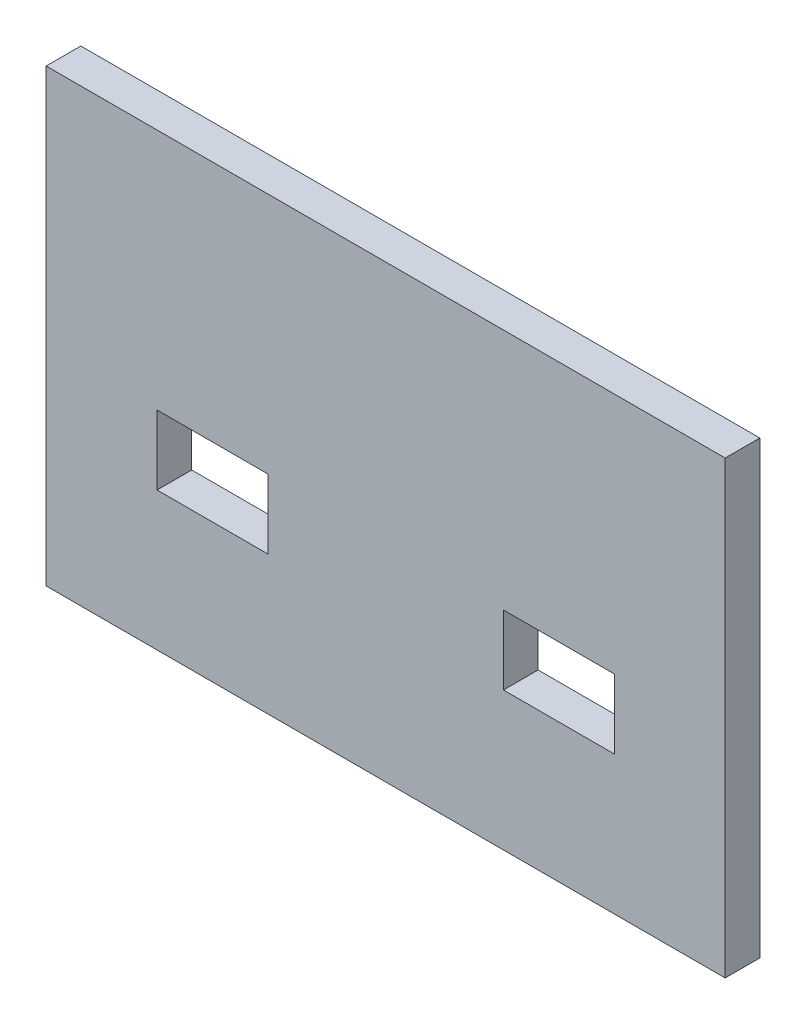
ISO-10303-21;
HEADER;
FILE_DESCRIPTION(('STEP AP214'),'2;1');
FILE_NAME('part.step','',(''),(''),'','','');
FILE_SCHEMA(('AUTOMOTIVE_DESIGN { 1 0 10303 214 1 1 1 1 }'));
ENDSEC;
DATA;
#1=APPLICATION_CONTEXT('core data for automotive mechanical design processes');
#2=APPLICATION_PROTOCOL_DEFINITION('international standard','automotive_design',2000,#1);
#3=PRODUCT_CONTEXT('',#1,'mechanical');
#4=PRODUCT('Part','Part','',(#3));
#5=PRODUCT_RELATED_PRODUCT_CATEGORY('part','',(#4));
#6=PRODUCT_DEFINITION_FORMATION('','',#4);
#7=PRODUCT_DEFINITION_CONTEXT('part definition',#1,'design');
#8=PRODUCT_DEFINITION('design','',#6,#7);
#9=PRODUCT_DEFINITION_SHAPE('','',#8);
#10=(LENGTH_UNIT() NAMED_UNIT(*) SI_UNIT(.MILLI.,.METRE.));
#11=(NAMED_UNIT(*) PLANE_ANGLE_UNIT() SI_UNIT($,.RADIAN.));
#12=(NAMED_UNIT(*) SI_UNIT($,.STERADIAN.) SOLID_ANGLE_UNIT());
#13=UNCERTAINTY_MEASURE_WITH_UNIT(LENGTH_MEASURE(1.E-05),#10,'distance_accuracy_value','');
#14=(GEOMETRIC_REPRESENTATION_CONTEXT(3) GLOBAL_UNCERTAINTY_ASSIGNED_CONTEXT((#13)) GLOBAL_UNIT_ASSIGNED_CONTEXT((#10,
#11,#12)) REPRESENTATION_CONTEXT('',''));
#15=CARTESIAN_POINT('',(0.,0.,0.));
#16=DIRECTION('',(0.,0.,1.));
#17=DIRECTION('',(1.,0.,0.));
#18=AXIS2_PLACEMENT_3D('',#15,#16,#17);
#19=CARTESIAN_POINT('',(0.,0.,5.));
#20=DIRECTION('',(0.,0.,1.));
#21=DIRECTION('',(1.,0.,0.));
#22=AXIS2_PLACEMENT_3D('',#19,#20,#21);
#23=PLANE('',#22);
#24=DIRECTION('',(0.,-1.,0.));
#25=VECTOR('',#24,1.);
#26=CARTESIAN_POINT('',(0.,0.,5.));
#27=LINE('',#26,#25);
#28=CARTESIAN_POINT('',(0.,0.,5.));
#29=VERTEX_POINT('',#28);
#30=CARTESIAN_POINT('',(0.,-65.,5.));
#31=VERTEX_POINT('',#30);
#32=EDGE_CURVE('E169',#29,#31,#27,.T.);
#33=ORIENTED_EDGE('',*,*,#32,.T.);
#34=DIRECTION('',(1.,0.,0.));
#35=VECTOR('',#34,1.);
#36=CARTESIAN_POINT('',(0.,-65.,5.));
#37=LINE('',#36,#35);
#38=CARTESIAN_POINT('',(98.,-65.,5.));
#39=VERTEX_POINT('',#38);
#40=EDGE_CURVE('E172',#31,#39,#37,.T.);
#41=ORIENTED_EDGE('',*,*,#40,.T.);
#42=DIRECTION('',(0.,1.,0.));
#43=VECTOR('',#42,1.);
#44=CARTESIAN_POINT('',(98.,0.,5.));
#45=LINE('',#44,#43);
#46=CARTESIAN_POINT('',(98.,0.,5.));
#47=VERTEX_POINT('',#46);
#48=EDGE_CURVE('E175',#39,#47,#45,.T.);
#49=ORIENTED_EDGE('',*,*,#48,.T.);
#50=DIRECTION('',(-1.,0.,0.));
#51=VECTOR('',#50,1.);
#52=CARTESIAN_POINT('',(0.,0.,5.));
#53=LINE('',#52,#51);
#54=EDGE_CURVE('E177',#47,#29,#53,.T.);
#55=ORIENTED_EDGE('',*,*,#54,.T.);
#56=EDGE_LOOP('',(#33,#41,#49,#55));
#57=FACE_BOUND('',#56,.T.);
#58=DIRECTION('',(1.,0.,0.));
#59=VECTOR('',#58,1.);
#60=CARTESIAN_POINT('',(0.,-35.,5.));
#61=LINE('',#60,#59);
#62=CARTESIAN_POINT('',(16.,-35.,5.));
#63=VERTEX_POINT('',#62);
#64=CARTESIAN_POINT('',(32.,-35.,5.));
#65=VERTEX_POINT('',#64);
#66=EDGE_CURVE('E150',#63,#65,#61,.T.);
#67=ORIENTED_EDGE('',*,*,#66,.T.);
#68=DIRECTION('',(0.,-1.,0.));
#69=VECTOR('',#68,1.);
#70=CARTESIAN_POINT('',(32.,0.,5.));
#71=LINE('',#70,#69);
#72=CARTESIAN_POINT('',(32.,-45.,5.));
#73=VERTEX_POINT('',#72);
#74=EDGE_CURVE('E145',#65,#73,#71,.T.);
#75=ORIENTED_EDGE('',*,*,#74,.T.);
#76=DIRECTION('',(1.,0.,0.));
#77=VECTOR('',#76,1.);
#78=CARTESIAN_POINT('',(0.,-45.,5.));
#79=LINE('',#78,#77);
#80=CARTESIAN_POINT('',(16.,-45.,5.));
#81=VERTEX_POINT('',#80);
#82=EDGE_CURVE('E156',#81,#73,#79,.T.);
#83=ORIENTED_EDGE('',*,*,#82,.F.);
#84=DIRECTION('',(0.,-1.,0.));
#85=VECTOR('',#84,1.);
#86=CARTESIAN_POINT('',(16.,0.,5.));
#87=LINE('',#86,#85);
#88=EDGE_CURVE('E153',#63,#81,#87,.T.);
#89=ORIENTED_EDGE('',*,*,#88,.F.);
#90=EDGE_LOOP('',(#67,#75,#83,#89));
#91=FACE_BOUND('',#90,.T.);
#92=DIRECTION('',(1.,0.,0.));
#93=VECTOR('',#92,1.);
#94=CARTESIAN_POINT('',(0.,-35.,5.));
#95=LINE('',#94,#93);
#96=CARTESIAN_POINT('',(66.,-35.,5.));
#97=VERTEX_POINT('',#96);
#98=CARTESIAN_POINT('',(82.,-35.,5.));
#99=VERTEX_POINT('',#98);
#100=EDGE_CURVE('E133',#97,#99,#95,.T.);
#101=ORIENTED_EDGE('',*,*,#100,.T.);
#102=DIRECTION('',(0.,-1.,0.));
#103=VECTOR('',#102,1.);
#104=CARTESIAN_POINT('',(82.,0.,5.));
#105=LINE('',#104,#103);
#106=CARTESIAN_POINT('',(82.,-45.,5.));
#107=VERTEX_POINT('',#106);
#108=EDGE_CURVE('E48',#99,#107,#105,.T.);
#109=ORIENTED_EDGE('',*,*,#108,.T.);
#110=DIRECTION('',(1.,0.,0.));
#111=VECTOR('',#110,1.);
#112=CARTESIAN_POINT('',(0.,-45.,5.));
#113=LINE('',#112,#111);
#114=CARTESIAN_POINT('',(66.,-45.,5.));
#115=VERTEX_POINT('',#114);
#116=EDGE_CURVE('E138',#115,#107,#113,.T.);
#117=ORIENTED_EDGE('',*,*,#116,.F.);
#118=DIRECTION('',(0.,-1.,0.));
#119=VECTOR('',#118,1.);
#120=CARTESIAN_POINT('',(66.,0.,5.));
#121=LINE('',#120,#119);
#122=EDGE_CURVE('E124',#97,#115,#121,.T.);
#123=ORIENTED_EDGE('',*,*,#122,.F.);
#124=EDGE_LOOP('',(#101,#109,#117,#123));
#125=FACE_BOUND('',#124,.T.);
#126=ADVANCED_FACE('F33',(#57,#91,#125),#23,.T.);
#127=CARTESIAN_POINT('',(0.,0.,0.));
#128=DIRECTION('',(0.,0.,1.));
#129=DIRECTION('',(1.,0.,0.));
#130=AXIS2_PLACEMENT_3D('',#127,#128,#129);
#131=PLANE('',#130);
#132=DIRECTION('',(0.,-1.,0.));
#133=VECTOR('',#132,1.);
#134=CARTESIAN_POINT('',(32.,0.,0.));
#135=LINE('',#134,#133);
#136=CARTESIAN_POINT('',(32.,-35.,0.));
#137=VERTEX_POINT('',#136);
#138=CARTESIAN_POINT('',(32.,-45.,0.));
#139=VERTEX_POINT('',#138);
#140=EDGE_CURVE('E206',#137,#139,#135,.T.);
#141=ORIENTED_EDGE('',*,*,#140,.F.);
#142=DIRECTION('',(1.,0.,0.));
#143=VECTOR('',#142,1.);
#144=CARTESIAN_POINT('',(0.,-35.,0.));
#145=LINE('',#144,#143);
#146=CARTESIAN_POINT('',(16.,-35.,0.));
#147=VERTEX_POINT('',#146);
#148=EDGE_CURVE('E198',#147,#137,#145,.T.);
#149=ORIENTED_EDGE('',*,*,#148,.F.);
#150=DIRECTION('',(0.,-1.,0.));
#151=VECTOR('',#150,1.);
#152=CARTESIAN_POINT('',(16.,0.,0.));
#153=LINE('',#152,#151);
#154=CARTESIAN_POINT('',(16.,-45.,0.));
#155=VERTEX_POINT('',#154);
#156=EDGE_CURVE('E200',#147,#155,#153,.T.);
#157=ORIENTED_EDGE('',*,*,#156,.T.);
#158=DIRECTION('',(1.,0.,0.));
#159=VECTOR('',#158,1.);
#160=CARTESIAN_POINT('',(0.,-45.,0.));
#161=LINE('',#160,#159);
#162=EDGE_CURVE('E203',#155,#139,#161,.T.);
#163=ORIENTED_EDGE('',*,*,#162,.T.);
#164=EDGE_LOOP('',(#141,#149,#157,#163));
#165=FACE_BOUND('',#164,.T.);
#166=DIRECTION('',(0.,-1.,0.));
#167=VECTOR('',#166,1.);
#168=CARTESIAN_POINT('',(0.,0.,0.));
#169=LINE('',#168,#167);
#170=CARTESIAN_POINT('',(0.,0.,0.));
#171=VERTEX_POINT('',#170);
#172=CARTESIAN_POINT('',(0.,-65.,0.));
#173=VERTEX_POINT('',#172);
#174=EDGE_CURVE('E162',#171,#173,#169,.T.);
#175=ORIENTED_EDGE('',*,*,#174,.F.);
#176=DIRECTION('',(-1.,0.,0.));
#177=VECTOR('',#176,1.);
#178=CARTESIAN_POINT('',(0.,0.,0.));
#179=LINE('',#178,#177);
#180=CARTESIAN_POINT('',(98.,0.,0.));
#181=VERTEX_POINT('',#180);
#182=EDGE_CURVE('E173',#181,#171,#179,.T.);
#183=ORIENTED_EDGE('',*,*,#182,.F.);
#184=DIRECTION('',(0.,1.,0.));
#185=VECTOR('',#184,1.);
#186=CARTESIAN_POINT('',(98.,0.,0.));
#187=LINE('',#186,#185);
#188=CARTESIAN_POINT('',(98.,-65.,0.));
#189=VERTEX_POINT('',#188);
#190=EDGE_CURVE('E184',#189,#181,#187,.T.);
#191=ORIENTED_EDGE('',*,*,#190,.F.);
#192=DIRECTION('',(1.,0.,0.));
#193=VECTOR('',#192,1.);
#194=CARTESIAN_POINT('',(0.,-65.,0.));
#195=LINE('',#194,#193);
#196=EDGE_CURVE('E182',#173,#189,#195,.T.);
#197=ORIENTED_EDGE('',*,*,#196,.F.);
#198=EDGE_LOOP('',(#175,#183,#191,#197));
#199=FACE_BOUND('',#198,.T.);
#200=DIRECTION('',(0.,-1.,0.));
#201=VECTOR('',#200,1.);
#202=CARTESIAN_POINT('',(82.,0.,0.));
#203=LINE('',#202,#201);
#204=CARTESIAN_POINT('',(82.,-35.,0.));
#205=VERTEX_POINT('',#204);
#206=CARTESIAN_POINT('',(82.,-45.,0.));
#207=VERTEX_POINT('',#206);
#208=EDGE_CURVE('E11',#205,#207,#203,.T.);
#209=ORIENTED_EDGE('',*,*,#208,.F.);
#210=DIRECTION('',(1.,0.,0.));
#211=VECTOR('',#210,1.);
#212=CARTESIAN_POINT('',(0.,-35.,0.));
#213=LINE('',#212,#211);
#214=CARTESIAN_POINT('',(66.,-35.,0.));
#215=VERTEX_POINT('',#214);
#216=EDGE_CURVE('E208',#215,#205,#213,.T.);
#217=ORIENTED_EDGE('',*,*,#216,.F.);
#218=DIRECTION('',(0.,-1.,0.));
#219=VECTOR('',#218,1.);
#220=CARTESIAN_POINT('',(66.,0.,0.));
#221=LINE('',#220,#219);
#222=CARTESIAN_POINT('',(66.,-45.,0.));
#223=VERTEX_POINT('',#222);
#224=EDGE_CURVE('E127',#215,#223,#221,.T.);
#225=ORIENTED_EDGE('',*,*,#224,.T.);
#226=DIRECTION('',(1.,0.,0.));
#227=VECTOR('',#226,1.);
#228=CARTESIAN_POINT('',(0.,-45.,0.));
#229=LINE('',#228,#227);
#230=EDGE_CURVE('E41',#223,#207,#229,.T.);
#231=ORIENTED_EDGE('',*,*,#230,.T.);
#232=EDGE_LOOP('',(#209,#217,#225,#231));
#233=FACE_BOUND('',#232,.T.);
#234=ADVANCED_FACE('F213',(#165,#199,#233),#131,.F.);
#235=CARTESIAN_POINT('',(0.,0.,5.));
#236=DIRECTION('',(1.,0.,0.));
#237=DIRECTION('',(0.,1.,0.));
#238=AXIS2_PLACEMENT_3D('',#235,#236,#237);
#239=PLANE('',#238);
#240=ORIENTED_EDGE('',*,*,#174,.T.);
#241=DIRECTION('',(0.,0.,-1.));
#242=VECTOR('',#241,1.);
#243=CARTESIAN_POINT('',(0.,-65.,5.));
#244=LINE('',#243,#242);
#245=EDGE_CURVE('E195',#31,#173,#244,.T.);
#246=ORIENTED_EDGE('',*,*,#245,.F.);
#247=ORIENTED_EDGE('',*,*,#32,.F.);
#248=DIRECTION('',(0.,0.,-1.));
#249=VECTOR('',#248,1.);
#250=CARTESIAN_POINT('',(0.,0.,5.));
#251=LINE('',#250,#249);
#252=EDGE_CURVE('E179',#29,#171,#251,.T.);
#253=ORIENTED_EDGE('',*,*,#252,.T.);
#254=EDGE_LOOP('',(#240,#246,#247,#253));
#255=FACE_BOUND('',#254,.T.);
#256=ADVANCED_FACE('F35',(#255),#239,.F.);
#257=CARTESIAN_POINT('',(0.,-65.,5.));
#258=DIRECTION('',(0.,1.,0.));
#259=DIRECTION('',(0.,0.,1.));
#260=AXIS2_PLACEMENT_3D('',#257,#258,#259);
#261=PLANE('',#260);
#262=ORIENTED_EDGE('',*,*,#196,.T.);
#263=DIRECTION('',(0.,0.,-1.));
#264=VECTOR('',#263,1.);
#265=CARTESIAN_POINT('',(98.,-65.,5.));
#266=LINE('',#265,#264);
#267=EDGE_CURVE('E192',#39,#189,#266,.T.);
#268=ORIENTED_EDGE('',*,*,#267,.F.);
#269=ORIENTED_EDGE('',*,*,#40,.F.);
#270=ORIENTED_EDGE('',*,*,#245,.T.);
#271=EDGE_LOOP('',(#262,#268,#269,#270));
#272=FACE_BOUND('',#271,.T.);
#273=ADVANCED_FACE('F249',(#272),#261,.F.);
#274=CARTESIAN_POINT('',(98.,0.,5.));
#275=DIRECTION('',(-1.,0.,0.));
#276=DIRECTION('',(0.,-1.,0.));
#277=AXIS2_PLACEMENT_3D('',#274,#275,#276);
#278=PLANE('',#277);
#279=ORIENTED_EDGE('',*,*,#190,.T.);
#280=DIRECTION('',(0.,0.,-1.));
#281=VECTOR('',#280,1.);
#282=CARTESIAN_POINT('',(98.,0.,5.));
#283=LINE('',#282,#281);
#284=EDGE_CURVE('E189',#47,#181,#283,.T.);
#285=ORIENTED_EDGE('',*,*,#284,.F.);
#286=ORIENTED_EDGE('',*,*,#48,.F.);
#287=ORIENTED_EDGE('',*,*,#267,.T.);
#288=EDGE_LOOP('',(#279,#285,#286,#287));
#289=FACE_BOUND('',#288,.T.);
#290=ADVANCED_FACE('F246',(#289),#278,.F.);
#291=CARTESIAN_POINT('',(0.,0.,5.));
#292=DIRECTION('',(0.,-1.,0.));
#293=DIRECTION('',(0.,0.,-1.));
#294=AXIS2_PLACEMENT_3D('',#291,#292,#293);
#295=PLANE('',#294);
#296=ORIENTED_EDGE('',*,*,#182,.T.);
#297=ORIENTED_EDGE('',*,*,#252,.F.);
#298=ORIENTED_EDGE('',*,*,#54,.F.);
#299=ORIENTED_EDGE('',*,*,#284,.T.);
#300=EDGE_LOOP('',(#296,#297,#298,#299));
#301=FACE_BOUND('',#300,.T.);
#302=ADVANCED_FACE('F243',(#301),#295,.F.);
#303=CARTESIAN_POINT('',(32.,0.,-10.));
#304=DIRECTION('',(-1.,0.,0.));
#305=DIRECTION('',(0.,-1.,0.));
#306=AXIS2_PLACEMENT_3D('',#303,#304,#305);
#307=PLANE('',#306);
#308=ORIENTED_EDGE('',*,*,#140,.T.);
#309=DIRECTION('',(0.,0.,1.));
#310=VECTOR('',#309,1.);
#311=CARTESIAN_POINT('',(32.,-45.,-10.));
#312=LINE('',#311,#310);
#313=EDGE_CURVE('E160',#139,#73,#312,.T.);
#314=ORIENTED_EDGE('',*,*,#313,.T.);
#315=ORIENTED_EDGE('',*,*,#74,.F.);
#316=DIRECTION('',(0.,0.,1.));
#317=VECTOR('',#316,1.);
#318=CARTESIAN_POINT('',(32.,-35.,-10.));
#319=LINE('',#318,#317);
#320=EDGE_CURVE('E159',#137,#65,#319,.T.);
#321=ORIENTED_EDGE('',*,*,#320,.F.);
#322=EDGE_LOOP('',(#308,#314,#315,#321));
#323=FACE_BOUND('',#322,.T.);
#324=ADVANCED_FACE('F241',(#323),#307,.T.);
#325=CARTESIAN_POINT('',(0.,-45.,-10.));
#326=DIRECTION('',(0.,-1.,0.));
#327=DIRECTION('',(1.,0.,0.));
#328=AXIS2_PLACEMENT_3D('',#325,#326,#327);
#329=PLANE('',#328);
#330=DIRECTION('',(0.,0.,1.));
#331=VECTOR('',#330,1.);
#332=CARTESIAN_POINT('',(16.,-45.,-10.));
#333=LINE('',#332,#331);
#334=EDGE_CURVE('E163',#155,#81,#333,.T.);
#335=ORIENTED_EDGE('',*,*,#334,.T.);
#336=ORIENTED_EDGE('',*,*,#82,.T.);
#337=ORIENTED_EDGE('',*,*,#313,.F.);
#338=ORIENTED_EDGE('',*,*,#162,.F.);
#339=EDGE_LOOP('',(#335,#336,#337,#338));
#340=FACE_BOUND('',#339,.T.);
#341=ADVANCED_FACE('F287',(#340),#329,.F.);
#342=CARTESIAN_POINT('',(16.,0.,-10.));
#343=DIRECTION('',(-1.,0.,0.));
#344=DIRECTION('',(0.,0.,1.));
#345=AXIS2_PLACEMENT_3D('',#342,#343,#344);
#346=PLANE('',#345);
#347=DIRECTION('',(0.,0.,1.));
#348=VECTOR('',#347,1.);
#349=CARTESIAN_POINT('',(16.,-35.,-10.));
#350=LINE('',#349,#348);
#351=EDGE_CURVE('E165',#147,#63,#350,.T.);
#352=ORIENTED_EDGE('',*,*,#351,.T.);
#353=ORIENTED_EDGE('',*,*,#88,.T.);
#354=ORIENTED_EDGE('',*,*,#334,.F.);
#355=ORIENTED_EDGE('',*,*,#156,.F.);
#356=EDGE_LOOP('',(#352,#353,#354,#355));
#357=FACE_BOUND('',#356,.T.);
#358=ADVANCED_FACE('F226',(#357),#346,.F.);
#359=CARTESIAN_POINT('',(0.,-35.,-10.));
#360=DIRECTION('',(0.,-1.,0.));
#361=DIRECTION('',(1.,0.,0.));
#362=AXIS2_PLACEMENT_3D('',#359,#360,#361);
#363=PLANE('',#362);
#364=ORIENTED_EDGE('',*,*,#148,.T.);
#365=ORIENTED_EDGE('',*,*,#320,.T.);
#366=ORIENTED_EDGE('',*,*,#66,.F.);
#367=ORIENTED_EDGE('',*,*,#351,.F.);
#368=EDGE_LOOP('',(#364,#365,#366,#367));
#369=FACE_BOUND('',#368,.T.);
#370=ADVANCED_FACE('F219',(#369),#363,.T.);
#371=CARTESIAN_POINT('',(82.,0.,-10.));
#372=DIRECTION('',(-1.,0.,0.));
#373=DIRECTION('',(0.,0.,1.));
#374=AXIS2_PLACEMENT_3D('',#371,#372,#373);
#375=PLANE('',#374);
#376=ORIENTED_EDGE('',*,*,#208,.T.);
#377=DIRECTION('',(0.,0.,1.));
#378=VECTOR('',#377,1.);
#379=CARTESIAN_POINT('',(82.,-45.,-10.));
#380=LINE('',#379,#378);
#381=EDGE_CURVE('E143',#207,#107,#380,.T.);
#382=ORIENTED_EDGE('',*,*,#381,.T.);
#383=ORIENTED_EDGE('',*,*,#108,.F.);
#384=DIRECTION('',(0.,0.,1.));
#385=VECTOR('',#384,1.);
#386=CARTESIAN_POINT('',(82.,-35.,-10.));
#387=LINE('',#386,#385);
#388=EDGE_CURVE('E130',#205,#99,#387,.T.);
#389=ORIENTED_EDGE('',*,*,#388,.F.);
#390=EDGE_LOOP('',(#376,#382,#383,#389));
#391=FACE_BOUND('',#390,.T.);
#392=ADVANCED_FACE('F217',(#391),#375,.T.);
#393=CARTESIAN_POINT('',(0.,-45.,-10.));
#394=DIRECTION('',(0.,-1.,0.));
#395=DIRECTION('',(0.,0.,-1.));
#396=AXIS2_PLACEMENT_3D('',#393,#394,#395);
#397=PLANE('',#396);
#398=DIRECTION('',(0.,0.,1.));
#399=VECTOR('',#398,1.);
#400=CARTESIAN_POINT('',(66.,-45.,-10.));
#401=LINE('',#400,#399);
#402=EDGE_CURVE('E129',#223,#115,#401,.T.);
#403=ORIENTED_EDGE('',*,*,#402,.T.);
#404=ORIENTED_EDGE('',*,*,#116,.T.);
#405=ORIENTED_EDGE('',*,*,#381,.F.);
#406=ORIENTED_EDGE('',*,*,#230,.F.);
#407=EDGE_LOOP('',(#403,#404,#405,#406));
#408=FACE_BOUND('',#407,.T.);
#409=ADVANCED_FACE('F216',(#408),#397,.F.);
#410=CARTESIAN_POINT('',(66.,0.,-10.));
#411=DIRECTION('',(-1.,0.,0.));
#412=DIRECTION('',(0.,0.,1.));
#413=AXIS2_PLACEMENT_3D('',#410,#411,#412);
#414=PLANE('',#413);
#415=DIRECTION('',(0.,0.,1.));
#416=VECTOR('',#415,1.);
#417=CARTESIAN_POINT('',(66.,-35.,-10.));
#418=LINE('',#417,#416);
#419=EDGE_CURVE('E56',#215,#97,#418,.T.);
#420=ORIENTED_EDGE('',*,*,#419,.T.);
#421=ORIENTED_EDGE('',*,*,#122,.T.);
#422=ORIENTED_EDGE('',*,*,#402,.F.);
#423=ORIENTED_EDGE('',*,*,#224,.F.);
#424=EDGE_LOOP('',(#420,#421,#422,#423));
#425=FACE_BOUND('',#424,.T.);
#426=ADVANCED_FACE('F121',(#425),#414,.F.);
#427=CARTESIAN_POINT('',(0.,-35.,-10.));
#428=DIRECTION('',(0.,-1.,0.));
#429=DIRECTION('',(0.,0.,-1.));
#430=AXIS2_PLACEMENT_3D('',#427,#428,#429);
#431=PLANE('',#430);
#432=ORIENTED_EDGE('',*,*,#216,.T.);
#433=ORIENTED_EDGE('',*,*,#388,.T.);
#434=ORIENTED_EDGE('',*,*,#100,.F.);
#435=ORIENTED_EDGE('',*,*,#419,.F.);
#436=EDGE_LOOP('',(#432,#433,#434,#435));
#437=FACE_BOUND('',#436,.T.);
#438=ADVANCED_FACE('F134',(#437),#431,.T.);
#439=CLOSED_SHELL('',(#126,#234,#256,#273,#290,#302,#324,#341,#358,#370,#392,#409,#426,#438));
#440=MANIFOLD_SOLID_BREP('B2',#439);
#441=ADVANCED_BREP_SHAPE_REPRESENTATION('',(#18,#440),#14);
#442=SHAPE_DEFINITION_REPRESENTATION(#9,#441);
ENDSEC;
END-ISO-10303-21;
